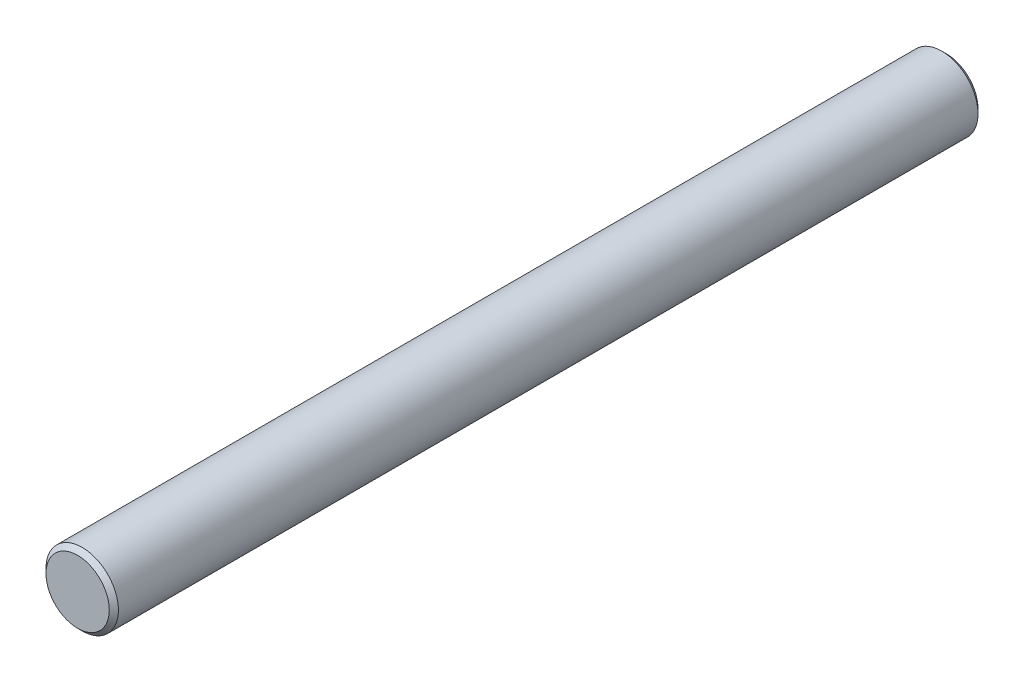
ISO-10303-21;
HEADER;
FILE_DESCRIPTION(('STEP AP214'),'2;1');
FILE_NAME('part.step','',(''),(''),'','','');
FILE_SCHEMA(('AUTOMOTIVE_DESIGN { 1 0 10303 214 1 1 1 1 }'));
ENDSEC;
DATA;
#1=APPLICATION_CONTEXT('core data for automotive mechanical design processes');
#2=APPLICATION_PROTOCOL_DEFINITION('international standard','automotive_design',2000,#1);
#3=PRODUCT_CONTEXT('',#1,'mechanical');
#4=PRODUCT('Part','Part','',(#3));
#5=PRODUCT_RELATED_PRODUCT_CATEGORY('part','',(#4));
#6=PRODUCT_DEFINITION_FORMATION('','',#4);
#7=PRODUCT_DEFINITION_CONTEXT('part definition',#1,'design');
#8=PRODUCT_DEFINITION('design','',#6,#7);
#9=PRODUCT_DEFINITION_SHAPE('','',#8);
#10=(LENGTH_UNIT() NAMED_UNIT(*) SI_UNIT(.MILLI.,.METRE.));
#11=(NAMED_UNIT(*) PLANE_ANGLE_UNIT() SI_UNIT($,.RADIAN.));
#12=(NAMED_UNIT(*) SI_UNIT($,.STERADIAN.) SOLID_ANGLE_UNIT());
#13=UNCERTAINTY_MEASURE_WITH_UNIT(LENGTH_MEASURE(1.E-05),#10,'distance_accuracy_value','');
#14=(GEOMETRIC_REPRESENTATION_CONTEXT(3) GLOBAL_UNCERTAINTY_ASSIGNED_CONTEXT((#13)) GLOBAL_UNIT_ASSIGNED_CONTEXT((#10,
#11,#12)) REPRESENTATION_CONTEXT('',''));
#15=CARTESIAN_POINT('',(0.,0.,0.));
#16=DIRECTION('',(0.,0.,1.));
#17=DIRECTION('',(1.,0.,0.));
#18=AXIS2_PLACEMENT_3D('',#15,#16,#17);
#19=CARTESIAN_POINT('',(0.,0.,76.2));
#20=DIRECTION('',(0.,0.,-1.));
#21=DIRECTION('',(-1.,0.,0.));
#22=AXIS2_PLACEMENT_3D('',#19,#20,#21);
#23=CYLINDRICAL_SURFACE('',#22,3.175);
#24=CARTESIAN_POINT('',(0.,0.,75.8));
#25=DIRECTION('',(0.,0.,1.));
#26=DIRECTION('',(1.,0.,0.));
#27=AXIS2_PLACEMENT_3D('',#24,#25,#26);
#28=CIRCLE('',#27,3.175);
#29=CARTESIAN_POINT('',(-3.175,0.,75.8));
#30=VERTEX_POINT('',#29);
#31=EDGE_CURVE('E38',#30,#30,#28,.F.);
#32=CARTESIAN_POINT('',(0.,0.,0.400000000000081));
#33=DIRECTION('',(0.,0.,1.));
#34=DIRECTION('',(1.,0.,0.));
#35=AXIS2_PLACEMENT_3D('',#32,#33,#34);
#36=CIRCLE('',#35,3.175);
#37=CARTESIAN_POINT('',(-3.175,0.,0.400000000000067));
#38=VERTEX_POINT('',#37);
#39=EDGE_CURVE('E42',#38,#38,#36,.T.);
#40=CARTESIAN_POINT('',(-3.175,0.,75.8));
#41=CARTESIAN_POINT('',(-3.175,0.,75.0145833333334));
#42=CARTESIAN_POINT('',(-3.175,0.,74.2291666666667));
#43=CARTESIAN_POINT('',(-3.175,0.,72.6583333333333));
#44=CARTESIAN_POINT('',(-3.175,0.,71.8729166666667));
#45=CARTESIAN_POINT('',(-3.175,0.,70.3020833333333));
#46=CARTESIAN_POINT('',(-3.175,0.,69.5166666666667));
#47=CARTESIAN_POINT('',(-3.175,0.,67.9458333333334));
#48=CARTESIAN_POINT('',(-3.175,0.,67.1604166666667));
#49=CARTESIAN_POINT('',(-3.175,0.,65.5895833333334));
#50=CARTESIAN_POINT('',(-3.175,0.,64.8041666666667));
#51=CARTESIAN_POINT('',(-3.175,0.,63.2333333333333));
#52=CARTESIAN_POINT('',(-3.175,0.,62.4479166666667));
#53=CARTESIAN_POINT('',(-3.175,0.,60.8770833333334));
#54=CARTESIAN_POINT('',(-3.175,0.,60.0916666666667));
#55=CARTESIAN_POINT('',(-3.175,0.,58.5208333333334));
#56=CARTESIAN_POINT('',(-3.175,0.,57.7354166666667));
#57=CARTESIAN_POINT('',(-3.175,0.,56.1645833333334));
#58=CARTESIAN_POINT('',(-3.175,0.,55.3791666666667));
#59=CARTESIAN_POINT('',(-3.175,0.,53.8083333333334));
#60=CARTESIAN_POINT('',(-3.175,0.,53.0229166666667));
#61=CARTESIAN_POINT('',(-3.175,0.,51.4520833333334));
#62=CARTESIAN_POINT('',(-3.175,0.,50.6666666666667));
#63=CARTESIAN_POINT('',(-3.175,0.,49.0958333333334));
#64=CARTESIAN_POINT('',(-3.175,0.,48.3104166666667));
#65=CARTESIAN_POINT('',(-3.175,0.,46.7395833333334));
#66=CARTESIAN_POINT('',(-3.175,0.,45.9541666666667));
#67=CARTESIAN_POINT('',(-3.175,0.,44.3833333333334));
#68=CARTESIAN_POINT('',(-3.175,0.,43.5979166666667));
#69=CARTESIAN_POINT('',(-3.175,0.,42.0270833333334));
#70=CARTESIAN_POINT('',(-3.175,0.,41.2416666666667));
#71=CARTESIAN_POINT('',(-3.175,0.,39.6708333333334));
#72=CARTESIAN_POINT('',(-3.175,0.,38.8854166666667));
#73=CARTESIAN_POINT('',(-3.175,0.,37.3145833333334));
#74=CARTESIAN_POINT('',(-3.175,0.,36.5291666666667));
#75=CARTESIAN_POINT('',(-3.175,0.,34.9583333333334));
#76=CARTESIAN_POINT('',(-3.175,0.,34.1729166666667));
#77=CARTESIAN_POINT('',(-3.175,0.,32.6020833333334));
#78=CARTESIAN_POINT('',(-3.175,0.,31.8166666666667));
#79=CARTESIAN_POINT('',(-3.175,0.,30.2458333333334));
#80=CARTESIAN_POINT('',(-3.175,0.,29.4604166666667));
#81=CARTESIAN_POINT('',(-3.175,0.,27.8895833333334));
#82=CARTESIAN_POINT('',(-3.175,0.,27.1041666666667));
#83=CARTESIAN_POINT('',(-3.175,0.,25.5333333333334));
#84=CARTESIAN_POINT('',(-3.175,0.,24.7479166666667));
#85=CARTESIAN_POINT('',(-3.175,0.,23.1770833333334));
#86=CARTESIAN_POINT('',(-3.175,0.,22.3916666666667));
#87=CARTESIAN_POINT('',(-3.175,0.,20.8208333333334));
#88=CARTESIAN_POINT('',(-3.175,0.,20.0354166666667));
#89=CARTESIAN_POINT('',(-3.175,0.,18.4645833333334));
#90=CARTESIAN_POINT('',(-3.175,0.,17.6791666666667));
#91=CARTESIAN_POINT('',(-3.175,0.,16.1083333333334));
#92=CARTESIAN_POINT('',(-3.175,0.,15.3229166666667));
#93=CARTESIAN_POINT('',(-3.175,0.,13.7520833333334));
#94=CARTESIAN_POINT('',(-3.175,0.,12.9666666666667));
#95=CARTESIAN_POINT('',(-3.175,0.,11.3958333333334));
#96=CARTESIAN_POINT('',(-3.175,0.,10.6104166666667));
#97=CARTESIAN_POINT('',(-3.175,0.,9.03958333333339));
#98=CARTESIAN_POINT('',(-3.175,0.,8.25416666666672));
#99=CARTESIAN_POINT('',(-3.175,0.,6.68333333333338));
#100=CARTESIAN_POINT('',(-3.175,0.,5.89791666666672));
#101=CARTESIAN_POINT('',(-3.175,0.,4.32708333333339));
#102=CARTESIAN_POINT('',(-3.175,0.,3.54166666666673));
#103=CARTESIAN_POINT('',(-3.175,0.,1.9708333333334));
#104=CARTESIAN_POINT('',(-3.175,0.,1.18541666666674));
#105=CARTESIAN_POINT('',(-3.175,0.,0.400000000000067));
#106=B_SPLINE_CURVE_WITH_KNOTS('',3,(#40,#41,#42,#43,#44,#45,#46,#47,#48,#49,#50,#51,#52,#53,
#54,#55,#56,#57,#58,#59,#60,#61,#62,#63,#64,#65,#66,#67,#68,#69,#70,#71,#72,#73,#74,#75,#76,#77,
#78,#79,#80,#81,#82,#83,#84,#85,#86,#87,#88,#89,#90,#91,#92,#93,#94,#95,#96,#97,#98,#99,#100,
#101,#102,#103,#104,#105),.UNSPECIFIED.,.F.,.F.,(4,2,2,2,2,2,2,2,2,2,2,2,2,2,2,2,2,2,2,2,2,2,2,
2,2,2,2,2,2,2,2,2,4),(0.,2.35625,4.71250000000001,7.06875,9.425,11.78125,14.1375,16.49375,18.85,
21.20625,23.5625,25.91875,28.275,30.63125,32.9875,35.34375,37.7,40.05625,42.4125,44.76875,
47.125,49.48125,51.8375,54.19375,56.55,58.90625,61.2625,63.61875,65.975,68.33125,70.6875,
73.0437499999999,75.3999999999999),.UNSPECIFIED.);
#107=EDGE_CURVE('BSEAM31',#30,#38,#106,.T.);
#108=ORIENTED_EDGE('',*,*,#31,.T.);
#109=ORIENTED_EDGE('',*,*,#39,.T.);
#110=ORIENTED_EDGE('',*,*,#107,.T.);
#111=ORIENTED_EDGE('',*,*,#107,.F.);
#112=EDGE_LOOP('',(#108,#110,#109,#111));
#113=FACE_BOUND('',#112,.T.);
#114=ADVANCED_FACE('F31',(#113),#23,.T.);
#115=CARTESIAN_POINT('',(0.,0.,76.2));
#116=DIRECTION('',(0.,0.,1.));
#117=DIRECTION('',(1.,0.,0.));
#118=AXIS2_PLACEMENT_3D('',#115,#116,#117);
#119=PLANE('',#118);
#120=CARTESIAN_POINT('',(0.,0.,76.2));
#121=DIRECTION('',(0.,0.,1.));
#122=DIRECTION('',(1.,0.,0.));
#123=AXIS2_PLACEMENT_3D('',#120,#121,#122);
#124=CIRCLE('',#123,2.77500000000002);
#125=CARTESIAN_POINT('',(2.77500000000002,0.,76.2));
#126=VERTEX_POINT('',#125);
#127=EDGE_CURVE('E46',#126,#126,#124,.T.);
#128=ORIENTED_EDGE('',*,*,#127,.T.);
#129=EDGE_LOOP('',(#128));
#130=FACE_BOUND('',#129,.T.);
#131=ADVANCED_FACE('F52',(#130),#119,.T.);
#132=CARTESIAN_POINT('',(0.,0.,0.));
#133=DIRECTION('',(0.,0.,1.));
#134=DIRECTION('',(1.,0.,0.));
#135=AXIS2_PLACEMENT_3D('',#132,#133,#134);
#136=PLANE('',#135);
#137=CARTESIAN_POINT('',(0.,0.,0.));
#138=DIRECTION('',(0.,0.,1.));
#139=DIRECTION('',(1.,0.,0.));
#140=AXIS2_PLACEMENT_3D('',#137,#138,#139);
#141=CIRCLE('',#140,2.77499999999992);
#142=CARTESIAN_POINT('',(2.77499999999992,0.,0.));
#143=VERTEX_POINT('',#142);
#144=EDGE_CURVE('E10',#143,#143,#141,.F.);
#145=ORIENTED_EDGE('',*,*,#144,.T.);
#146=EDGE_LOOP('',(#145));
#147=FACE_BOUND('',#146,.T.);
#148=ADVANCED_FACE('F56',(#147),#136,.F.);
#149=CARTESIAN_POINT('',(0.,0.,76.2));
#150=DIRECTION('',(0.,0.,-1.));
#151=DIRECTION('',(-1.,0.,0.));
#152=AXIS2_PLACEMENT_3D('',#149,#150,#151);
#153=CONICAL_SURFACE('',#152,2.77500000000002,0.785398163397443);
#154=ORIENTED_EDGE('',*,*,#31,.F.);
#155=EDGE_LOOP('',(#154));
#156=FACE_BOUND('',#155,.T.);
#157=ORIENTED_EDGE('',*,*,#127,.F.);
#158=EDGE_LOOP('',(#157));
#159=FACE_BOUND('',#158,.T.);
#160=ADVANCED_FACE('F54',(#156,#159),#153,.T.);
#161=CARTESIAN_POINT('',(0.,0.,0.400000000000081));
#162=DIRECTION('',(0.,0.,1.));
#163=DIRECTION('',(1.,0.,0.));
#164=AXIS2_PLACEMENT_3D('',#161,#162,#163);
#165=CONICAL_SURFACE('',#164,3.175,0.785398163397443);
#166=ORIENTED_EDGE('',*,*,#144,.F.);
#167=EDGE_LOOP('',(#166));
#168=FACE_BOUND('',#167,.T.);
#169=ORIENTED_EDGE('',*,*,#39,.F.);
#170=EDGE_LOOP('',(#169));
#171=FACE_BOUND('',#170,.T.);
#172=ADVANCED_FACE('F33',(#168,#171),#165,.T.);
#173=CLOSED_SHELL('',(#114,#131,#148,#160,#172));
#174=MANIFOLD_SOLID_BREP('B2',#173);
#175=ADVANCED_BREP_SHAPE_REPRESENTATION('',(#18,#174),#14);
#176=SHAPE_DEFINITION_REPRESENTATION(#9,#175);
ENDSEC;
END-ISO-10303-21;
